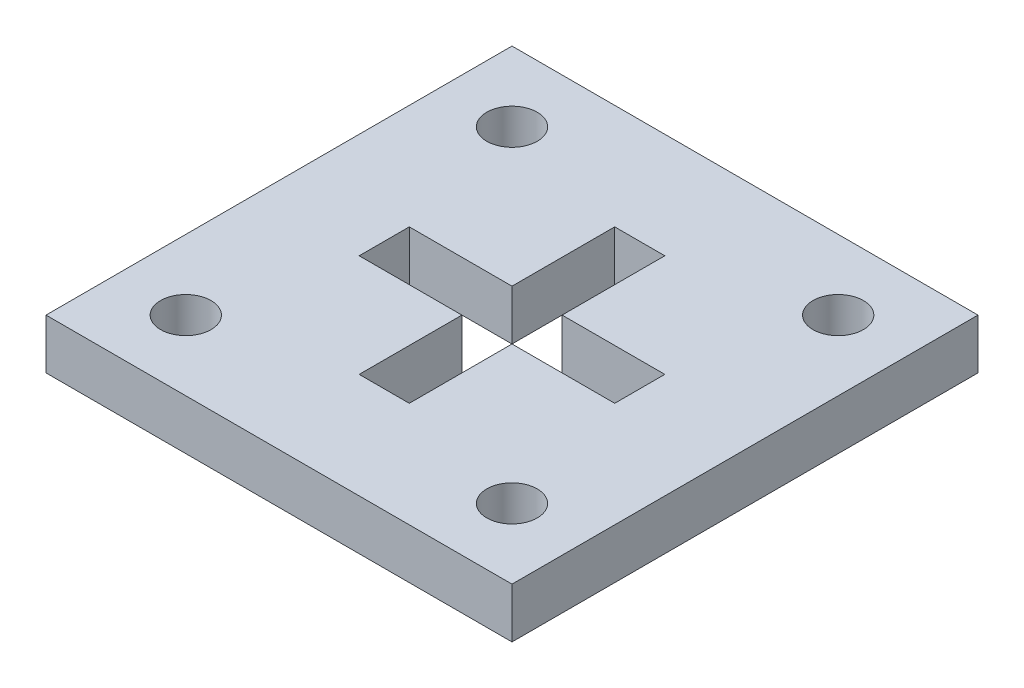
ISO-10303-21;
HEADER;
FILE_DESCRIPTION(('STEP AP214'),'2;1');
FILE_NAME('part.step','',(''),(''),'','','');
FILE_SCHEMA(('AUTOMOTIVE_DESIGN { 1 0 10303 214 1 1 1 1 }'));
ENDSEC;
DATA;
#1=APPLICATION_CONTEXT('core data for automotive mechanical design processes');
#2=APPLICATION_PROTOCOL_DEFINITION('international standard','automotive_design',2000,#1);
#3=PRODUCT_CONTEXT('',#1,'mechanical');
#4=PRODUCT('Part','Part','',(#3));
#5=PRODUCT_RELATED_PRODUCT_CATEGORY('part','',(#4));
#6=PRODUCT_DEFINITION_FORMATION('','',#4);
#7=PRODUCT_DEFINITION_CONTEXT('part definition',#1,'design');
#8=PRODUCT_DEFINITION('design','',#6,#7);
#9=PRODUCT_DEFINITION_SHAPE('','',#8);
#10=(LENGTH_UNIT() NAMED_UNIT(*) SI_UNIT(.MILLI.,.METRE.));
#11=(NAMED_UNIT(*) PLANE_ANGLE_UNIT() SI_UNIT($,.RADIAN.));
#12=(NAMED_UNIT(*) SI_UNIT($,.STERADIAN.) SOLID_ANGLE_UNIT());
#13=UNCERTAINTY_MEASURE_WITH_UNIT(LENGTH_MEASURE(1.E-05),#10,'distance_accuracy_value','');
#14=(GEOMETRIC_REPRESENTATION_CONTEXT(3) GLOBAL_UNCERTAINTY_ASSIGNED_CONTEXT((#13)) GLOBAL_UNIT_ASSIGNED_CONTEXT((#10,
#11,#12)) REPRESENTATION_CONTEXT('',''));
#15=CARTESIAN_POINT('',(0.,0.,0.));
#16=DIRECTION('',(0.,0.,1.));
#17=DIRECTION('',(1.,0.,0.));
#18=AXIS2_PLACEMENT_3D('',#15,#16,#17);
#19=CARTESIAN_POINT('',(0.,5.461,0.));
#20=DIRECTION('',(1.,0.,0.));
#21=DIRECTION('',(0.,0.,-1.));
#22=AXIS2_PLACEMENT_3D('',#19,#20,#21);
#23=PLANE('',#22);
#24=DIRECTION('',(0.,0.,1.));
#25=VECTOR('',#24,1.);
#26=CARTESIAN_POINT('',(0.,0.,0.));
#27=LINE('',#26,#25);
#28=CARTESIAN_POINT('',(0.,0.,-50.8));
#29=VERTEX_POINT('',#28);
#30=CARTESIAN_POINT('',(0.,0.,0.));
#31=VERTEX_POINT('',#30);
#32=EDGE_CURVE('E228',#29,#31,#27,.T.);
#33=ORIENTED_EDGE('',*,*,#32,.T.);
#34=DIRECTION('',(0.,-1.,0.));
#35=VECTOR('',#34,1.);
#36=CARTESIAN_POINT('',(0.,5.461,0.));
#37=LINE('',#36,#35);
#38=CARTESIAN_POINT('',(0.,5.461,0.));
#39=VERTEX_POINT('',#38);
#40=EDGE_CURVE('E11',#39,#31,#37,.T.);
#41=ORIENTED_EDGE('',*,*,#40,.F.);
#42=DIRECTION('',(0.,0.,1.));
#43=VECTOR('',#42,1.);
#44=CARTESIAN_POINT('',(0.,5.461,0.));
#45=LINE('',#44,#43);
#46=CARTESIAN_POINT('',(0.,5.461,-50.8));
#47=VERTEX_POINT('',#46);
#48=EDGE_CURVE('E248',#47,#39,#45,.T.);
#49=ORIENTED_EDGE('',*,*,#48,.F.);
#50=DIRECTION('',(0.,-1.,0.));
#51=VECTOR('',#50,1.);
#52=CARTESIAN_POINT('',(0.,5.461,-50.8));
#53=LINE('',#52,#51);
#54=EDGE_CURVE('E258',#47,#29,#53,.T.);
#55=ORIENTED_EDGE('',*,*,#54,.T.);
#56=EDGE_LOOP('',(#33,#41,#49,#55));
#57=FACE_BOUND('',#56,.T.);
#58=ADVANCED_FACE('F32',(#57),#23,.F.);
#59=CARTESIAN_POINT('',(0.,5.461,0.));
#60=DIRECTION('',(0.,0.,-1.));
#61=DIRECTION('',(-1.,0.,0.));
#62=AXIS2_PLACEMENT_3D('',#59,#60,#61);
#63=PLANE('',#62);
#64=DIRECTION('',(1.,0.,0.));
#65=VECTOR('',#64,1.);
#66=CARTESIAN_POINT('',(0.,0.,0.));
#67=LINE('',#66,#65);
#68=CARTESIAN_POINT('',(50.8,0.,0.));
#69=VERTEX_POINT('',#68);
#70=EDGE_CURVE('E261',#31,#69,#67,.T.);
#71=ORIENTED_EDGE('',*,*,#70,.T.);
#72=DIRECTION('',(0.,-1.,0.));
#73=VECTOR('',#72,1.);
#74=CARTESIAN_POINT('',(50.8,5.461,0.));
#75=LINE('',#74,#73);
#76=CARTESIAN_POINT('',(50.8,5.461,0.));
#77=VERTEX_POINT('',#76);
#78=EDGE_CURVE('E39',#77,#69,#75,.T.);
#79=ORIENTED_EDGE('',*,*,#78,.F.);
#80=DIRECTION('',(1.,0.,0.));
#81=VECTOR('',#80,1.);
#82=CARTESIAN_POINT('',(0.,5.461,0.));
#83=LINE('',#82,#81);
#84=EDGE_CURVE('E251',#39,#77,#83,.T.);
#85=ORIENTED_EDGE('',*,*,#84,.F.);
#86=ORIENTED_EDGE('',*,*,#40,.T.);
#87=EDGE_LOOP('',(#71,#79,#85,#86));
#88=FACE_BOUND('',#87,.T.);
#89=ADVANCED_FACE('F289',(#88),#63,.F.);
#90=CARTESIAN_POINT('',(50.8,5.461,0.));
#91=DIRECTION('',(-1.,0.,0.));
#92=DIRECTION('',(0.,0.,1.));
#93=AXIS2_PLACEMENT_3D('',#90,#91,#92);
#94=PLANE('',#93);
#95=DIRECTION('',(0.,0.,-1.));
#96=VECTOR('',#95,1.);
#97=CARTESIAN_POINT('',(50.8,0.,0.));
#98=LINE('',#97,#96);
#99=CARTESIAN_POINT('',(50.8,0.,-50.8));
#100=VERTEX_POINT('',#99);
#101=EDGE_CURVE('E263',#69,#100,#98,.T.);
#102=ORIENTED_EDGE('',*,*,#101,.T.);
#103=DIRECTION('',(0.,-1.,0.));
#104=VECTOR('',#103,1.);
#105=CARTESIAN_POINT('',(50.8,5.461,-50.8));
#106=LINE('',#105,#104);
#107=CARTESIAN_POINT('',(50.8,5.461,-50.8));
#108=VERTEX_POINT('',#107);
#109=EDGE_CURVE('E268',#108,#100,#106,.T.);
#110=ORIENTED_EDGE('',*,*,#109,.F.);
#111=DIRECTION('',(0.,0.,-1.));
#112=VECTOR('',#111,1.);
#113=CARTESIAN_POINT('',(50.8,5.461,0.));
#114=LINE('',#113,#112);
#115=EDGE_CURVE('E254',#77,#108,#114,.T.);
#116=ORIENTED_EDGE('',*,*,#115,.F.);
#117=ORIENTED_EDGE('',*,*,#78,.T.);
#118=EDGE_LOOP('',(#102,#110,#116,#117));
#119=FACE_BOUND('',#118,.T.);
#120=ADVANCED_FACE('F275',(#119),#94,.F.);
#121=CARTESIAN_POINT('',(0.,5.461,-50.8));
#122=DIRECTION('',(0.,0.,1.));
#123=DIRECTION('',(1.,0.,0.));
#124=AXIS2_PLACEMENT_3D('',#121,#122,#123);
#125=PLANE('',#124);
#126=DIRECTION('',(-1.,0.,0.));
#127=VECTOR('',#126,1.);
#128=CARTESIAN_POINT('',(0.,0.,-50.8));
#129=LINE('',#128,#127);
#130=EDGE_CURVE('E252',#100,#29,#129,.T.);
#131=ORIENTED_EDGE('',*,*,#130,.T.);
#132=ORIENTED_EDGE('',*,*,#54,.F.);
#133=DIRECTION('',(-1.,0.,0.));
#134=VECTOR('',#133,1.);
#135=CARTESIAN_POINT('',(0.,5.461,-50.8));
#136=LINE('',#135,#134);
#137=EDGE_CURVE('E256',#108,#47,#136,.T.);
#138=ORIENTED_EDGE('',*,*,#137,.F.);
#139=ORIENTED_EDGE('',*,*,#109,.T.);
#140=EDGE_LOOP('',(#131,#132,#138,#139));
#141=FACE_BOUND('',#140,.T.);
#142=ADVANCED_FACE('F282',(#141),#125,.F.);
#143=CARTESIAN_POINT('',(0.,5.461,0.));
#144=DIRECTION('',(0.,-1.,0.));
#145=DIRECTION('',(0.,0.,-1.));
#146=AXIS2_PLACEMENT_3D('',#143,#144,#145);
#147=PLANE('',#146);
#148=CARTESIAN_POINT('',(7.61999999999999,5.461,-43.18));
#149=DIRECTION('',(0.,1.,0.));
#150=DIRECTION('',(0.,0.,1.));
#151=AXIS2_PLACEMENT_3D('',#148,#149,#150);
#152=CIRCLE('',#151,2.75);
#153=CARTESIAN_POINT('',(7.61999999999999,5.461,-40.43));
#154=VERTEX_POINT('',#153);
#155=EDGE_CURVE('E371',#154,#154,#152,.T.);
#156=ORIENTED_EDGE('',*,*,#155,.F.);
#157=EDGE_LOOP('',(#156));
#158=FACE_BOUND('',#157,.T.);
#159=CARTESIAN_POINT('',(43.18,5.461,-43.18));
#160=DIRECTION('',(0.,1.,0.));
#161=DIRECTION('',(0.,0.,1.));
#162=AXIS2_PLACEMENT_3D('',#159,#160,#161);
#163=CIRCLE('',#162,2.75);
#164=CARTESIAN_POINT('',(43.18,5.461,-40.43));
#165=VERTEX_POINT('',#164);
#166=EDGE_CURVE('E373',#165,#165,#163,.T.);
#167=ORIENTED_EDGE('',*,*,#166,.F.);
#168=EDGE_LOOP('',(#167));
#169=FACE_BOUND('',#168,.T.);
#170=CARTESIAN_POINT('',(43.18,5.461,-7.62));
#171=DIRECTION('',(0.,1.,0.));
#172=DIRECTION('',(0.,0.,1.));
#173=AXIS2_PLACEMENT_3D('',#170,#171,#172);
#174=CIRCLE('',#173,2.75);
#175=CARTESIAN_POINT('',(43.18,5.461,-4.87));
#176=VERTEX_POINT('',#175);
#177=EDGE_CURVE('E381',#176,#176,#174,.T.);
#178=ORIENTED_EDGE('',*,*,#177,.F.);
#179=EDGE_LOOP('',(#178));
#180=FACE_BOUND('',#179,.T.);
#181=CARTESIAN_POINT('',(7.61999999999999,5.461,-7.62));
#182=DIRECTION('',(0.,1.,0.));
#183=DIRECTION('',(0.,0.,1.));
#184=AXIS2_PLACEMENT_3D('',#181,#182,#183);
#185=CIRCLE('',#184,2.75);
#186=CARTESIAN_POINT('',(7.61999999999999,5.461,-4.87));
#187=VERTEX_POINT('',#186);
#188=EDGE_CURVE('E386',#187,#187,#185,.T.);
#189=ORIENTED_EDGE('',*,*,#188,.F.);
#190=EDGE_LOOP('',(#189));
#191=FACE_BOUND('',#190,.T.);
#192=DIRECTION('',(-1.,0.,0.));
#193=VECTOR('',#192,1.);
#194=CARTESIAN_POINT('',(11.4723333333333,5.461,-28.1305));
#195=LINE('',#194,#193);
#196=CARTESIAN_POINT('',(22.6695,5.461,-28.1305));
#197=VERTEX_POINT('',#196);
#198=CARTESIAN_POINT('',(11.4723333333333,5.461,-28.1305));
#199=VERTEX_POINT('',#198);
#200=EDGE_CURVE('E198',#197,#199,#195,.T.);
#201=ORIENTED_EDGE('',*,*,#200,.F.);
#202=DIRECTION('',(0.,0.,1.));
#203=VECTOR('',#202,1.);
#204=CARTESIAN_POINT('',(22.6695,5.461,-39.3276666666666));
#205=LINE('',#204,#203);
#206=CARTESIAN_POINT('',(22.6695,5.461,-39.3276666666666));
#207=VERTEX_POINT('',#206);
#208=EDGE_CURVE('E46',#207,#197,#205,.T.);
#209=ORIENTED_EDGE('',*,*,#208,.F.);
#210=DIRECTION('',(-1.,0.,0.));
#211=VECTOR('',#210,1.);
#212=CARTESIAN_POINT('',(22.6695,5.461,-39.3276666666666));
#213=LINE('',#212,#211);
#214=CARTESIAN_POINT('',(28.1305,5.461,-39.3276666666666));
#215=VERTEX_POINT('',#214);
#216=EDGE_CURVE('E163',#215,#207,#213,.T.);
#217=ORIENTED_EDGE('',*,*,#216,.F.);
#218=DIRECTION('',(0.,0.,-1.));
#219=VECTOR('',#218,1.);
#220=CARTESIAN_POINT('',(28.1305,5.461,-39.3276666666666));
#221=LINE('',#220,#219);
#222=CARTESIAN_POINT('',(28.1305,5.461,-28.1305));
#223=VERTEX_POINT('',#222);
#224=EDGE_CURVE('E166',#223,#215,#221,.T.);
#225=ORIENTED_EDGE('',*,*,#224,.F.);
#226=DIRECTION('',(-1.,0.,0.));
#227=VECTOR('',#226,1.);
#228=CARTESIAN_POINT('',(28.1305,5.461,-28.1305));
#229=LINE('',#228,#227);
#230=CARTESIAN_POINT('',(39.3276666666667,5.461,-28.1305));
#231=VERTEX_POINT('',#230);
#232=EDGE_CURVE('E221',#231,#223,#229,.T.);
#233=ORIENTED_EDGE('',*,*,#232,.F.);
#234=DIRECTION('',(0.,0.,-1.));
#235=VECTOR('',#234,1.);
#236=CARTESIAN_POINT('',(39.3276666666667,5.461,-28.1305));
#237=LINE('',#236,#235);
#238=CARTESIAN_POINT('',(39.3276666666667,5.461,-22.6695));
#239=VERTEX_POINT('',#238);
#240=EDGE_CURVE('E218',#239,#231,#237,.T.);
#241=ORIENTED_EDGE('',*,*,#240,.F.);
#242=DIRECTION('',(1.,0.,0.));
#243=VECTOR('',#242,1.);
#244=CARTESIAN_POINT('',(28.1305,5.461,-22.6695));
#245=LINE('',#244,#243);
#246=CARTESIAN_POINT('',(28.1305,5.461,-22.6695));
#247=VERTEX_POINT('',#246);
#248=EDGE_CURVE('E215',#247,#239,#245,.T.);
#249=ORIENTED_EDGE('',*,*,#248,.F.);
#250=DIRECTION('',(0.,0.,-1.));
#251=VECTOR('',#250,1.);
#252=CARTESIAN_POINT('',(28.1305,5.461,-22.6695));
#253=LINE('',#252,#251);
#254=CARTESIAN_POINT('',(28.1305,5.461,-11.4723333333333));
#255=VERTEX_POINT('',#254);
#256=EDGE_CURVE('E212',#255,#247,#253,.T.);
#257=ORIENTED_EDGE('',*,*,#256,.F.);
#258=DIRECTION('',(1.,0.,0.));
#259=VECTOR('',#258,1.);
#260=CARTESIAN_POINT('',(22.6695,5.461,-11.4723333333333));
#261=LINE('',#260,#259);
#262=CARTESIAN_POINT('',(22.6695,5.461,-11.4723333333333));
#263=VERTEX_POINT('',#262);
#264=EDGE_CURVE('E209',#263,#255,#261,.T.);
#265=ORIENTED_EDGE('',*,*,#264,.F.);
#266=DIRECTION('',(0.,0.,1.));
#267=VECTOR('',#266,1.);
#268=CARTESIAN_POINT('',(22.6695,5.461,-22.6695));
#269=LINE('',#268,#267);
#270=CARTESIAN_POINT('',(22.6695,5.461,-22.6695));
#271=VERTEX_POINT('',#270);
#272=EDGE_CURVE('E206',#271,#263,#269,.T.);
#273=ORIENTED_EDGE('',*,*,#272,.F.);
#274=DIRECTION('',(1.,0.,0.));
#275=VECTOR('',#274,1.);
#276=CARTESIAN_POINT('',(11.4723333333333,5.461,-22.6695));
#277=LINE('',#276,#275);
#278=CARTESIAN_POINT('',(11.4723333333333,5.461,-22.6695));
#279=VERTEX_POINT('',#278);
#280=EDGE_CURVE('E203',#279,#271,#277,.T.);
#281=ORIENTED_EDGE('',*,*,#280,.F.);
#282=DIRECTION('',(0.,0.,1.));
#283=VECTOR('',#282,1.);
#284=CARTESIAN_POINT('',(11.4723333333333,5.461,-28.1305));
#285=LINE('',#284,#283);
#286=EDGE_CURVE('E200',#199,#279,#285,.T.);
#287=ORIENTED_EDGE('',*,*,#286,.F.);
#288=EDGE_LOOP('',(#201,#209,#217,#225,#233,#241,#249,#257,#265,#273,#281,#287));
#289=FACE_BOUND('',#288,.T.);
#290=ORIENTED_EDGE('',*,*,#48,.T.);
#291=ORIENTED_EDGE('',*,*,#84,.T.);
#292=ORIENTED_EDGE('',*,*,#115,.T.);
#293=ORIENTED_EDGE('',*,*,#137,.T.);
#294=EDGE_LOOP('',(#290,#291,#292,#293));
#295=FACE_BOUND('',#294,.T.);
#296=ADVANCED_FACE('F288',(#158,#169,#180,#191,#289,#295),#147,.F.);
#297=CARTESIAN_POINT('',(0.,0.,0.));
#298=DIRECTION('',(0.,-1.,0.));
#299=DIRECTION('',(0.,0.,-1.));
#300=AXIS2_PLACEMENT_3D('',#297,#298,#299);
#301=PLANE('',#300);
#302=CARTESIAN_POINT('',(7.61999999999999,0.,-43.18));
#303=DIRECTION('',(0.,1.,0.));
#304=DIRECTION('',(0.,0.,1.));
#305=AXIS2_PLACEMENT_3D('',#302,#303,#304);
#306=CIRCLE('',#305,2.75);
#307=CARTESIAN_POINT('',(7.61999999999999,0.,-40.43));
#308=VERTEX_POINT('',#307);
#309=EDGE_CURVE('E368',#308,#308,#306,.T.);
#310=ORIENTED_EDGE('',*,*,#309,.T.);
#311=EDGE_LOOP('',(#310));
#312=FACE_BOUND('',#311,.T.);
#313=CARTESIAN_POINT('',(43.18,0.,-43.18));
#314=DIRECTION('',(0.,1.,0.));
#315=DIRECTION('',(0.,0.,1.));
#316=AXIS2_PLACEMENT_3D('',#313,#314,#315);
#317=CIRCLE('',#316,2.75);
#318=CARTESIAN_POINT('',(43.18,0.,-40.43));
#319=VERTEX_POINT('',#318);
#320=EDGE_CURVE('E378',#319,#319,#317,.T.);
#321=ORIENTED_EDGE('',*,*,#320,.T.);
#322=EDGE_LOOP('',(#321));
#323=FACE_BOUND('',#322,.T.);
#324=CARTESIAN_POINT('',(43.18,0.,-7.62));
#325=DIRECTION('',(0.,1.,0.));
#326=DIRECTION('',(0.,0.,1.));
#327=AXIS2_PLACEMENT_3D('',#324,#325,#326);
#328=CIRCLE('',#327,2.75);
#329=CARTESIAN_POINT('',(43.18,0.,-4.87000000000001));
#330=VERTEX_POINT('',#329);
#331=EDGE_CURVE('E384',#330,#330,#328,.T.);
#332=ORIENTED_EDGE('',*,*,#331,.T.);
#333=EDGE_LOOP('',(#332));
#334=FACE_BOUND('',#333,.T.);
#335=CARTESIAN_POINT('',(7.61999999999999,0.,-7.62));
#336=DIRECTION('',(0.,1.,0.));
#337=DIRECTION('',(0.,0.,1.));
#338=AXIS2_PLACEMENT_3D('',#335,#336,#337);
#339=CIRCLE('',#338,2.75);
#340=CARTESIAN_POINT('',(7.61999999999999,0.,-4.87));
#341=VERTEX_POINT('',#340);
#342=EDGE_CURVE('E169',#341,#341,#339,.T.);
#343=ORIENTED_EDGE('',*,*,#342,.T.);
#344=EDGE_LOOP('',(#343));
#345=FACE_BOUND('',#344,.T.);
#346=DIRECTION('',(0.,0.,1.));
#347=VECTOR('',#346,1.);
#348=CARTESIAN_POINT('',(22.6695,0.,-39.3276666666666));
#349=LINE('',#348,#347);
#350=CARTESIAN_POINT('',(22.6695,0.,-39.3276666666666));
#351=VERTEX_POINT('',#350);
#352=CARTESIAN_POINT('',(22.6695,0.,-28.1305));
#353=VERTEX_POINT('',#352);
#354=EDGE_CURVE('E146',#351,#353,#349,.T.);
#355=ORIENTED_EDGE('',*,*,#354,.T.);
#356=DIRECTION('',(-1.,0.,0.));
#357=VECTOR('',#356,1.);
#358=CARTESIAN_POINT('',(11.4723333333333,0.,-28.1305));
#359=LINE('',#358,#357);
#360=CARTESIAN_POINT('',(11.4723333333333,0.,-28.1305));
#361=VERTEX_POINT('',#360);
#362=EDGE_CURVE('E155',#353,#361,#359,.T.);
#363=ORIENTED_EDGE('',*,*,#362,.T.);
#364=DIRECTION('',(0.,0.,1.));
#365=VECTOR('',#364,1.);
#366=CARTESIAN_POINT('',(11.4723333333333,0.,-28.1305));
#367=LINE('',#366,#365);
#368=CARTESIAN_POINT('',(11.4723333333333,0.,-22.6695));
#369=VERTEX_POINT('',#368);
#370=EDGE_CURVE('E54',#361,#369,#367,.T.);
#371=ORIENTED_EDGE('',*,*,#370,.T.);
#372=DIRECTION('',(1.,0.,0.));
#373=VECTOR('',#372,1.);
#374=CARTESIAN_POINT('',(11.4723333333333,0.,-22.6695));
#375=LINE('',#374,#373);
#376=CARTESIAN_POINT('',(22.6695,0.,-22.6695));
#377=VERTEX_POINT('',#376);
#378=EDGE_CURVE('E173',#369,#377,#375,.T.);
#379=ORIENTED_EDGE('',*,*,#378,.T.);
#380=DIRECTION('',(0.,0.,1.));
#381=VECTOR('',#380,1.);
#382=CARTESIAN_POINT('',(22.6695,0.,-22.6695));
#383=LINE('',#382,#381);
#384=CARTESIAN_POINT('',(22.6695,0.,-11.4723333333333));
#385=VERTEX_POINT('',#384);
#386=EDGE_CURVE('E176',#377,#385,#383,.T.);
#387=ORIENTED_EDGE('',*,*,#386,.T.);
#388=DIRECTION('',(1.,0.,0.));
#389=VECTOR('',#388,1.);
#390=CARTESIAN_POINT('',(22.6695,0.,-11.4723333333333));
#391=LINE('',#390,#389);
#392=CARTESIAN_POINT('',(28.1305,0.,-11.4723333333333));
#393=VERTEX_POINT('',#392);
#394=EDGE_CURVE('E179',#385,#393,#391,.T.);
#395=ORIENTED_EDGE('',*,*,#394,.T.);
#396=DIRECTION('',(0.,0.,-1.));
#397=VECTOR('',#396,1.);
#398=CARTESIAN_POINT('',(28.1305,0.,-22.6695));
#399=LINE('',#398,#397);
#400=CARTESIAN_POINT('',(28.1305,0.,-22.6695));
#401=VERTEX_POINT('',#400);
#402=EDGE_CURVE('E182',#393,#401,#399,.T.);
#403=ORIENTED_EDGE('',*,*,#402,.T.);
#404=DIRECTION('',(1.,0.,0.));
#405=VECTOR('',#404,1.);
#406=CARTESIAN_POINT('',(28.1305,0.,-22.6695));
#407=LINE('',#406,#405);
#408=CARTESIAN_POINT('',(39.3276666666667,0.,-22.6695));
#409=VERTEX_POINT('',#408);
#410=EDGE_CURVE('E185',#401,#409,#407,.T.);
#411=ORIENTED_EDGE('',*,*,#410,.T.);
#412=DIRECTION('',(0.,0.,-1.));
#413=VECTOR('',#412,1.);
#414=CARTESIAN_POINT('',(39.3276666666667,0.,-28.1305));
#415=LINE('',#414,#413);
#416=CARTESIAN_POINT('',(39.3276666666667,0.,-28.1305));
#417=VERTEX_POINT('',#416);
#418=EDGE_CURVE('E188',#409,#417,#415,.T.);
#419=ORIENTED_EDGE('',*,*,#418,.T.);
#420=DIRECTION('',(-1.,0.,0.));
#421=VECTOR('',#420,1.);
#422=CARTESIAN_POINT('',(28.1305,0.,-28.1305));
#423=LINE('',#422,#421);
#424=CARTESIAN_POINT('',(28.1305,0.,-28.1305));
#425=VERTEX_POINT('',#424);
#426=EDGE_CURVE('E191',#417,#425,#423,.T.);
#427=ORIENTED_EDGE('',*,*,#426,.T.);
#428=DIRECTION('',(0.,0.,-1.));
#429=VECTOR('',#428,1.);
#430=CARTESIAN_POINT('',(28.1305,0.,-39.3276666666666));
#431=LINE('',#430,#429);
#432=CARTESIAN_POINT('',(28.1305,0.,-39.3276666666666));
#433=VERTEX_POINT('',#432);
#434=EDGE_CURVE('E194',#425,#433,#431,.T.);
#435=ORIENTED_EDGE('',*,*,#434,.T.);
#436=DIRECTION('',(-1.,0.,0.));
#437=VECTOR('',#436,1.);
#438=CARTESIAN_POINT('',(22.6695,0.,-39.3276666666666));
#439=LINE('',#438,#437);
#440=EDGE_CURVE('E152',#433,#351,#439,.T.);
#441=ORIENTED_EDGE('',*,*,#440,.T.);
#442=EDGE_LOOP('',(#355,#363,#371,#379,#387,#395,#403,#411,#419,#427,#435,#441));
#443=FACE_BOUND('',#442,.T.);
#444=ORIENTED_EDGE('',*,*,#32,.F.);
#445=ORIENTED_EDGE('',*,*,#130,.F.);
#446=ORIENTED_EDGE('',*,*,#101,.F.);
#447=ORIENTED_EDGE('',*,*,#70,.F.);
#448=EDGE_LOOP('',(#444,#445,#446,#447));
#449=FACE_BOUND('',#448,.T.);
#450=ADVANCED_FACE('F159',(#312,#323,#334,#345,#443,#449),#301,.T.);
#451=CARTESIAN_POINT('',(22.6695,0.,-39.3276666666666));
#452=DIRECTION('',(-1.,0.,0.));
#453=DIRECTION('',(0.,0.,1.));
#454=AXIS2_PLACEMENT_3D('',#451,#452,#453);
#455=PLANE('',#454);
#456=ORIENTED_EDGE('',*,*,#208,.T.);
#457=DIRECTION('',(0.,1.,0.));
#458=VECTOR('',#457,1.);
#459=CARTESIAN_POINT('',(22.6695,0.,-28.1305));
#460=LINE('',#459,#458);
#461=EDGE_CURVE('E142',#353,#197,#460,.T.);
#462=ORIENTED_EDGE('',*,*,#461,.F.);
#463=ORIENTED_EDGE('',*,*,#354,.F.);
#464=DIRECTION('',(0.,1.,0.));
#465=VECTOR('',#464,1.);
#466=CARTESIAN_POINT('',(22.6695,0.,-39.3276666666666));
#467=LINE('',#466,#465);
#468=EDGE_CURVE('E226',#351,#207,#467,.T.);
#469=ORIENTED_EDGE('',*,*,#468,.T.);
#470=EDGE_LOOP('',(#456,#462,#463,#469));
#471=FACE_BOUND('',#470,.T.);
#472=ADVANCED_FACE('F144',(#471),#455,.F.);
#473=CARTESIAN_POINT('',(22.6695,0.,-39.3276666666666));
#474=DIRECTION('',(0.,0.,-1.));
#475=DIRECTION('',(-1.,0.,0.));
#476=AXIS2_PLACEMENT_3D('',#473,#474,#475);
#477=PLANE('',#476);
#478=ORIENTED_EDGE('',*,*,#216,.T.);
#479=ORIENTED_EDGE('',*,*,#468,.F.);
#480=ORIENTED_EDGE('',*,*,#440,.F.);
#481=DIRECTION('',(0.,1.,0.));
#482=VECTOR('',#481,1.);
#483=CARTESIAN_POINT('',(28.1305,0.,-39.3276666666666));
#484=LINE('',#483,#482);
#485=EDGE_CURVE('E229',#433,#215,#484,.T.);
#486=ORIENTED_EDGE('',*,*,#485,.T.);
#487=EDGE_LOOP('',(#478,#479,#480,#486));
#488=FACE_BOUND('',#487,.T.);
#489=ADVANCED_FACE('F307',(#488),#477,.F.);
#490=CARTESIAN_POINT('',(28.1305,0.,-39.3276666666666));
#491=DIRECTION('',(1.,0.,0.));
#492=DIRECTION('',(0.,0.,-1.));
#493=AXIS2_PLACEMENT_3D('',#490,#491,#492);
#494=PLANE('',#493);
#495=ORIENTED_EDGE('',*,*,#224,.T.);
#496=ORIENTED_EDGE('',*,*,#485,.F.);
#497=ORIENTED_EDGE('',*,*,#434,.F.);
#498=DIRECTION('',(0.,1.,0.));
#499=VECTOR('',#498,1.);
#500=CARTESIAN_POINT('',(28.1305,0.,-28.1305));
#501=LINE('',#500,#499);
#502=EDGE_CURVE('E231',#425,#223,#501,.T.);
#503=ORIENTED_EDGE('',*,*,#502,.T.);
#504=EDGE_LOOP('',(#495,#496,#497,#503));
#505=FACE_BOUND('',#504,.T.);
#506=ADVANCED_FACE('F341',(#505),#494,.F.);
#507=CARTESIAN_POINT('',(28.1305,0.,-28.1305));
#508=DIRECTION('',(0.,0.,-1.));
#509=DIRECTION('',(-1.,0.,0.));
#510=AXIS2_PLACEMENT_3D('',#507,#508,#509);
#511=PLANE('',#510);
#512=ORIENTED_EDGE('',*,*,#232,.T.);
#513=ORIENTED_EDGE('',*,*,#502,.F.);
#514=ORIENTED_EDGE('',*,*,#426,.F.);
#515=DIRECTION('',(0.,1.,0.));
#516=VECTOR('',#515,1.);
#517=CARTESIAN_POINT('',(39.3276666666667,0.,-28.1305));
#518=LINE('',#517,#516);
#519=EDGE_CURVE('E233',#417,#231,#518,.T.);
#520=ORIENTED_EDGE('',*,*,#519,.T.);
#521=EDGE_LOOP('',(#512,#513,#514,#520));
#522=FACE_BOUND('',#521,.T.);
#523=ADVANCED_FACE('F337',(#522),#511,.F.);
#524=CARTESIAN_POINT('',(39.3276666666667,0.,-28.1305));
#525=DIRECTION('',(1.,0.,0.));
#526=DIRECTION('',(0.,0.,-1.));
#527=AXIS2_PLACEMENT_3D('',#524,#525,#526);
#528=PLANE('',#527);
#529=ORIENTED_EDGE('',*,*,#240,.T.);
#530=ORIENTED_EDGE('',*,*,#519,.F.);
#531=ORIENTED_EDGE('',*,*,#418,.F.);
#532=DIRECTION('',(0.,1.,0.));
#533=VECTOR('',#532,1.);
#534=CARTESIAN_POINT('',(39.3276666666667,0.,-22.6695));
#535=LINE('',#534,#533);
#536=EDGE_CURVE('E235',#409,#239,#535,.T.);
#537=ORIENTED_EDGE('',*,*,#536,.T.);
#538=EDGE_LOOP('',(#529,#530,#531,#537));
#539=FACE_BOUND('',#538,.T.);
#540=ADVANCED_FACE('F333',(#539),#528,.F.);
#541=CARTESIAN_POINT('',(28.1305,0.,-22.6695));
#542=DIRECTION('',(0.,0.,1.));
#543=DIRECTION('',(1.,0.,0.));
#544=AXIS2_PLACEMENT_3D('',#541,#542,#543);
#545=PLANE('',#544);
#546=ORIENTED_EDGE('',*,*,#248,.T.);
#547=ORIENTED_EDGE('',*,*,#536,.F.);
#548=ORIENTED_EDGE('',*,*,#410,.F.);
#549=DIRECTION('',(0.,1.,0.));
#550=VECTOR('',#549,1.);
#551=CARTESIAN_POINT('',(28.1305,0.,-22.6695));
#552=LINE('',#551,#550);
#553=EDGE_CURVE('E237',#401,#247,#552,.T.);
#554=ORIENTED_EDGE('',*,*,#553,.T.);
#555=EDGE_LOOP('',(#546,#547,#548,#554));
#556=FACE_BOUND('',#555,.T.);
#557=ADVANCED_FACE('F329',(#556),#545,.F.);
#558=CARTESIAN_POINT('',(28.1305,0.,-22.6695));
#559=DIRECTION('',(1.,0.,0.));
#560=DIRECTION('',(0.,0.,-1.));
#561=AXIS2_PLACEMENT_3D('',#558,#559,#560);
#562=PLANE('',#561);
#563=ORIENTED_EDGE('',*,*,#256,.T.);
#564=ORIENTED_EDGE('',*,*,#553,.F.);
#565=ORIENTED_EDGE('',*,*,#402,.F.);
#566=DIRECTION('',(0.,1.,0.));
#567=VECTOR('',#566,1.);
#568=CARTESIAN_POINT('',(28.1305,0.,-11.4723333333333));
#569=LINE('',#568,#567);
#570=EDGE_CURVE('E239',#393,#255,#569,.T.);
#571=ORIENTED_EDGE('',*,*,#570,.T.);
#572=EDGE_LOOP('',(#563,#564,#565,#571));
#573=FACE_BOUND('',#572,.T.);
#574=ADVANCED_FACE('F325',(#573),#562,.F.);
#575=CARTESIAN_POINT('',(22.6695,0.,-11.4723333333333));
#576=DIRECTION('',(0.,0.,1.));
#577=DIRECTION('',(1.,0.,0.));
#578=AXIS2_PLACEMENT_3D('',#575,#576,#577);
#579=PLANE('',#578);
#580=ORIENTED_EDGE('',*,*,#264,.T.);
#581=ORIENTED_EDGE('',*,*,#570,.F.);
#582=ORIENTED_EDGE('',*,*,#394,.F.);
#583=DIRECTION('',(0.,1.,0.));
#584=VECTOR('',#583,1.);
#585=CARTESIAN_POINT('',(22.6695,0.,-11.4723333333333));
#586=LINE('',#585,#584);
#587=EDGE_CURVE('E241',#385,#263,#586,.T.);
#588=ORIENTED_EDGE('',*,*,#587,.T.);
#589=EDGE_LOOP('',(#580,#581,#582,#588));
#590=FACE_BOUND('',#589,.T.);
#591=ADVANCED_FACE('F321',(#590),#579,.F.);
#592=CARTESIAN_POINT('',(22.6695,0.,-22.6695));
#593=DIRECTION('',(-1.,0.,0.));
#594=DIRECTION('',(0.,0.,1.));
#595=AXIS2_PLACEMENT_3D('',#592,#593,#594);
#596=PLANE('',#595);
#597=ORIENTED_EDGE('',*,*,#272,.T.);
#598=ORIENTED_EDGE('',*,*,#587,.F.);
#599=ORIENTED_EDGE('',*,*,#386,.F.);
#600=DIRECTION('',(0.,1.,0.));
#601=VECTOR('',#600,1.);
#602=CARTESIAN_POINT('',(22.6695,0.,-22.6695));
#603=LINE('',#602,#601);
#604=EDGE_CURVE('E243',#377,#271,#603,.T.);
#605=ORIENTED_EDGE('',*,*,#604,.T.);
#606=EDGE_LOOP('',(#597,#598,#599,#605));
#607=FACE_BOUND('',#606,.T.);
#608=ADVANCED_FACE('F317',(#607),#596,.F.);
#609=CARTESIAN_POINT('',(11.4723333333333,0.,-22.6695));
#610=DIRECTION('',(0.,0.,1.));
#611=DIRECTION('',(1.,0.,0.));
#612=AXIS2_PLACEMENT_3D('',#609,#610,#611);
#613=PLANE('',#612);
#614=ORIENTED_EDGE('',*,*,#280,.T.);
#615=ORIENTED_EDGE('',*,*,#604,.F.);
#616=ORIENTED_EDGE('',*,*,#378,.F.);
#617=DIRECTION('',(0.,1.,0.));
#618=VECTOR('',#617,1.);
#619=CARTESIAN_POINT('',(11.4723333333333,0.,-22.6695));
#620=LINE('',#619,#618);
#621=EDGE_CURVE('E245',#369,#279,#620,.T.);
#622=ORIENTED_EDGE('',*,*,#621,.T.);
#623=EDGE_LOOP('',(#614,#615,#616,#622));
#624=FACE_BOUND('',#623,.T.);
#625=ADVANCED_FACE('F314',(#624),#613,.F.);
#626=CARTESIAN_POINT('',(11.4723333333333,0.,-28.1305));
#627=DIRECTION('',(-1.,0.,0.));
#628=DIRECTION('',(0.,0.,1.));
#629=AXIS2_PLACEMENT_3D('',#626,#627,#628);
#630=PLANE('',#629);
#631=ORIENTED_EDGE('',*,*,#286,.T.);
#632=ORIENTED_EDGE('',*,*,#621,.F.);
#633=ORIENTED_EDGE('',*,*,#370,.F.);
#634=DIRECTION('',(0.,1.,0.));
#635=VECTOR('',#634,1.);
#636=CARTESIAN_POINT('',(11.4723333333333,0.,-28.1305));
#637=LINE('',#636,#635);
#638=EDGE_CURVE('E151',#361,#199,#637,.T.);
#639=ORIENTED_EDGE('',*,*,#638,.T.);
#640=EDGE_LOOP('',(#631,#632,#633,#639));
#641=FACE_BOUND('',#640,.T.);
#642=ADVANCED_FACE('F311',(#641),#630,.F.);
#643=CARTESIAN_POINT('',(11.4723333333333,0.,-28.1305));
#644=DIRECTION('',(0.,0.,-1.));
#645=DIRECTION('',(-1.,0.,0.));
#646=AXIS2_PLACEMENT_3D('',#643,#644,#645);
#647=PLANE('',#646);
#648=ORIENTED_EDGE('',*,*,#200,.T.);
#649=ORIENTED_EDGE('',*,*,#638,.F.);
#650=ORIENTED_EDGE('',*,*,#362,.F.);
#651=ORIENTED_EDGE('',*,*,#461,.T.);
#652=EDGE_LOOP('',(#648,#649,#650,#651));
#653=FACE_BOUND('',#652,.T.);
#654=ADVANCED_FACE('F156',(#653),#647,.F.);
#655=CARTESIAN_POINT('',(7.61999999999999,5.461,-7.62));
#656=DIRECTION('',(0.,1.,0.));
#657=DIRECTION('',(0.,0.,1.));
#658=AXIS2_PLACEMENT_3D('',#655,#656,#657);
#659=CYLINDRICAL_SURFACE('',#658,2.75);
#660=ORIENTED_EDGE('',*,*,#342,.F.);
#661=EDGE_LOOP('',(#660));
#662=FACE_BOUND('',#661,.T.);
#663=ORIENTED_EDGE('',*,*,#188,.T.);
#664=EDGE_LOOP('',(#663));
#665=FACE_BOUND('',#664,.T.);
#666=ADVANCED_FACE('F310',(#662,#665),#659,.F.);
#667=CARTESIAN_POINT('',(43.18,5.461,-7.62));
#668=DIRECTION('',(0.,1.,0.));
#669=DIRECTION('',(0.,0.,1.));
#670=AXIS2_PLACEMENT_3D('',#667,#668,#669);
#671=CYLINDRICAL_SURFACE('',#670,2.75);
#672=ORIENTED_EDGE('',*,*,#331,.F.);
#673=EDGE_LOOP('',(#672));
#674=FACE_BOUND('',#673,.T.);
#675=ORIENTED_EDGE('',*,*,#177,.T.);
#676=EDGE_LOOP('',(#675));
#677=FACE_BOUND('',#676,.T.);
#678=ADVANCED_FACE('F351',(#674,#677),#671,.F.);
#679=CARTESIAN_POINT('',(43.18,5.461,-43.18));
#680=DIRECTION('',(0.,1.,0.));
#681=DIRECTION('',(0.,0.,1.));
#682=AXIS2_PLACEMENT_3D('',#679,#680,#681);
#683=CYLINDRICAL_SURFACE('',#682,2.75);
#684=ORIENTED_EDGE('',*,*,#320,.F.);
#685=EDGE_LOOP('',(#684));
#686=FACE_BOUND('',#685,.T.);
#687=ORIENTED_EDGE('',*,*,#166,.T.);
#688=EDGE_LOOP('',(#687));
#689=FACE_BOUND('',#688,.T.);
#690=ADVANCED_FACE('F355',(#686,#689),#683,.F.);
#691=CARTESIAN_POINT('',(7.61999999999999,5.461,-43.18));
#692=DIRECTION('',(0.,1.,0.));
#693=DIRECTION('',(0.,0.,1.));
#694=AXIS2_PLACEMENT_3D('',#691,#692,#693);
#695=CYLINDRICAL_SURFACE('',#694,2.75);
#696=ORIENTED_EDGE('',*,*,#309,.F.);
#697=EDGE_LOOP('',(#696));
#698=FACE_BOUND('',#697,.T.);
#699=ORIENTED_EDGE('',*,*,#155,.T.);
#700=EDGE_LOOP('',(#699));
#701=FACE_BOUND('',#700,.T.);
#702=ADVANCED_FACE('F359',(#698,#701),#695,.F.);
#703=CLOSED_SHELL('',(#58,#89,#120,#142,#296,#450,#472,#489,#506,#523,#540,#557,#574,#591,#608,
#625,#642,#654,#666,#678,#690,#702));
#704=MANIFOLD_SOLID_BREP('B2',#703);
#705=ADVANCED_BREP_SHAPE_REPRESENTATION('',(#18,#704),#14);
#706=SHAPE_DEFINITION_REPRESENTATION(#9,#705);
ENDSEC;
END-ISO-10303-21;
